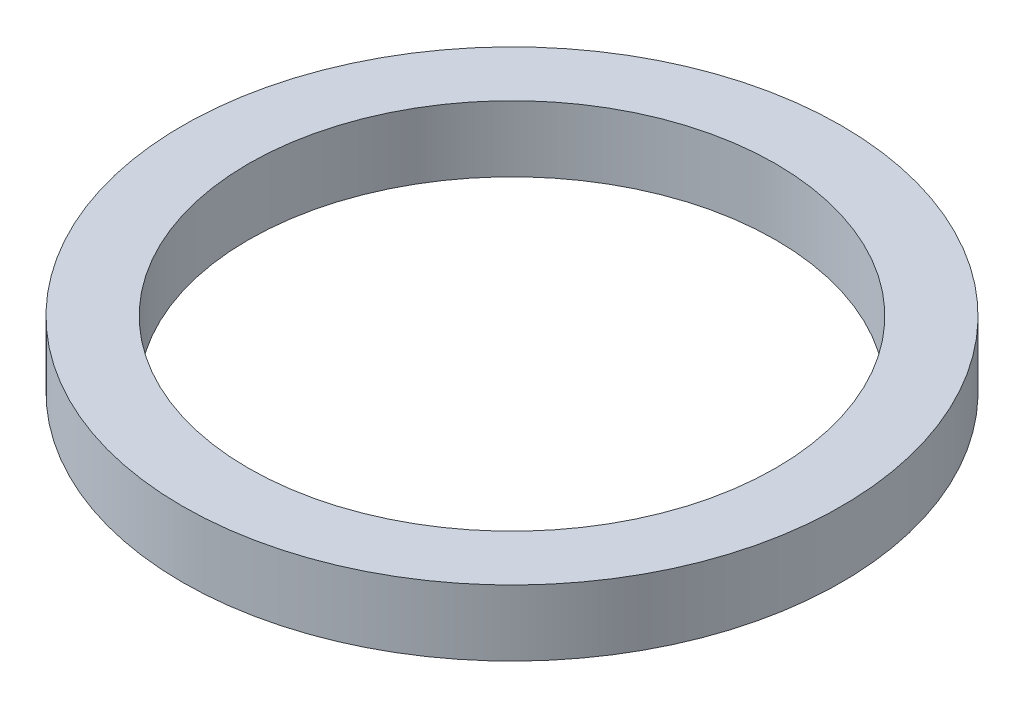
ISO-10303-21;
HEADER;
FILE_DESCRIPTION(('STEP AP214'),'2;1');
FILE_NAME('part.step','',(''),(''),'','','');
FILE_SCHEMA(('AUTOMOTIVE_DESIGN { 1 0 10303 214 1 1 1 1 }'));
ENDSEC;
DATA;
#1=APPLICATION_CONTEXT('core data for automotive mechanical design processes');
#2=APPLICATION_PROTOCOL_DEFINITION('international standard','automotive_design',2000,#1);
#3=PRODUCT_CONTEXT('',#1,'mechanical');
#4=PRODUCT('Part','Part','',(#3));
#5=PRODUCT_RELATED_PRODUCT_CATEGORY('part','',(#4));
#6=PRODUCT_DEFINITION_FORMATION('','',#4);
#7=PRODUCT_DEFINITION_CONTEXT('part definition',#1,'design');
#8=PRODUCT_DEFINITION('design','',#6,#7);
#9=PRODUCT_DEFINITION_SHAPE('','',#8);
#10=(LENGTH_UNIT() NAMED_UNIT(*) SI_UNIT(.MILLI.,.METRE.));
#11=(NAMED_UNIT(*) PLANE_ANGLE_UNIT() SI_UNIT($,.RADIAN.));
#12=(NAMED_UNIT(*) SI_UNIT($,.STERADIAN.) SOLID_ANGLE_UNIT());
#13=UNCERTAINTY_MEASURE_WITH_UNIT(LENGTH_MEASURE(1.E-05),#10,'distance_accuracy_value','');
#14=(GEOMETRIC_REPRESENTATION_CONTEXT(3) GLOBAL_UNCERTAINTY_ASSIGNED_CONTEXT((#13)) GLOBAL_UNIT_ASSIGNED_CONTEXT((#10,
#11,#12)) REPRESENTATION_CONTEXT('',''));
#15=CARTESIAN_POINT('',(0.,0.,0.));
#16=DIRECTION('',(0.,0.,1.));
#17=DIRECTION('',(1.,0.,0.));
#18=AXIS2_PLACEMENT_3D('',#15,#16,#17);
#19=CARTESIAN_POINT('',(0.,10.,0.));
#20=DIRECTION('',(0.,1.,0.));
#21=DIRECTION('',(0.,0.,1.));
#22=AXIS2_PLACEMENT_3D('',#19,#20,#21);
#23=PLANE('',#22);
#24=CARTESIAN_POINT('',(0.,10.,0.));
#25=DIRECTION('',(0.,1.,0.));
#26=DIRECTION('',(0.,0.,1.));
#27=AXIS2_PLACEMENT_3D('',#24,#25,#26);
#28=CIRCLE('',#27,50.);
#29=CARTESIAN_POINT('',(0.,10.,50.));
#30=VERTEX_POINT('',#29);
#31=EDGE_CURVE('E10',#30,#30,#28,.T.);
#32=ORIENTED_EDGE('',*,*,#31,.T.);
#33=EDGE_LOOP('',(#32));
#34=FACE_BOUND('',#33,.T.);
#35=CARTESIAN_POINT('',(0.,10.,0.));
#36=DIRECTION('',(0.,1.,0.));
#37=DIRECTION('',(0.,0.,1.));
#38=AXIS2_PLACEMENT_3D('',#35,#36,#37);
#39=CIRCLE('',#38,40.);
#40=CARTESIAN_POINT('',(0.,10.,40.));
#41=VERTEX_POINT('',#40);
#42=EDGE_CURVE('E42',#41,#41,#39,.T.);
#43=ORIENTED_EDGE('',*,*,#42,.F.);
#44=EDGE_LOOP('',(#43));
#45=FACE_BOUND('',#44,.T.);
#46=ADVANCED_FACE('F31',(#34,#45),#23,.T.);
#47=CARTESIAN_POINT('',(0.,0.,0.));
#48=DIRECTION('',(0.,1.,0.));
#49=DIRECTION('',(0.,0.,1.));
#50=AXIS2_PLACEMENT_3D('',#47,#48,#49);
#51=PLANE('',#50);
#52=CARTESIAN_POINT('',(0.,0.,0.));
#53=DIRECTION('',(0.,1.,0.));
#54=DIRECTION('',(0.,0.,1.));
#55=AXIS2_PLACEMENT_3D('',#52,#53,#54);
#56=CIRCLE('',#55,50.);
#57=CARTESIAN_POINT('',(0.,0.,50.));
#58=VERTEX_POINT('',#57);
#59=EDGE_CURVE('E35',#58,#58,#56,.T.);
#60=ORIENTED_EDGE('',*,*,#59,.F.);
#61=EDGE_LOOP('',(#60));
#62=FACE_BOUND('',#61,.T.);
#63=CARTESIAN_POINT('',(0.,0.,0.));
#64=DIRECTION('',(0.,1.,0.));
#65=DIRECTION('',(0.,0.,1.));
#66=AXIS2_PLACEMENT_3D('',#63,#64,#65);
#67=CIRCLE('',#66,40.);
#68=CARTESIAN_POINT('',(0.,0.,40.));
#69=VERTEX_POINT('',#68);
#70=EDGE_CURVE('E44',#69,#69,#67,.T.);
#71=ORIENTED_EDGE('',*,*,#70,.T.);
#72=EDGE_LOOP('',(#71));
#73=FACE_BOUND('',#72,.T.);
#74=ADVANCED_FACE('F54',(#62,#73),#51,.F.);
#75=CARTESIAN_POINT('',(0.,10.,0.));
#76=DIRECTION('',(0.,-1.,0.));
#77=DIRECTION('',(0.,0.,-1.));
#78=AXIS2_PLACEMENT_3D('',#75,#76,#77);
#79=CYLINDRICAL_SURFACE('',#78,50.);
#80=ORIENTED_EDGE('',*,*,#31,.F.);
#81=EDGE_LOOP('',(#80));
#82=FACE_BOUND('',#81,.T.);
#83=ORIENTED_EDGE('',*,*,#59,.T.);
#84=EDGE_LOOP('',(#83));
#85=FACE_BOUND('',#84,.T.);
#86=ADVANCED_FACE('F33',(#82,#85),#79,.T.);
#87=CARTESIAN_POINT('',(0.,10.,0.));
#88=DIRECTION('',(0.,-1.,0.));
#89=DIRECTION('',(0.,0.,-1.));
#90=AXIS2_PLACEMENT_3D('',#87,#88,#89);
#91=CYLINDRICAL_SURFACE('',#90,40.);
#92=ORIENTED_EDGE('',*,*,#42,.T.);
#93=EDGE_LOOP('',(#92));
#94=FACE_BOUND('',#93,.T.);
#95=ORIENTED_EDGE('',*,*,#70,.F.);
#96=EDGE_LOOP('',(#95));
#97=FACE_BOUND('',#96,.T.);
#98=ADVANCED_FACE('F50',(#94,#97),#91,.F.);
#99=CLOSED_SHELL('',(#46,#74,#86,#98));
#100=MANIFOLD_SOLID_BREP('B2',#99);
#101=ADVANCED_BREP_SHAPE_REPRESENTATION('',(#18,#100),#14);
#102=SHAPE_DEFINITION_REPRESENTATION(#9,#101);
ENDSEC;
END-ISO-10303-21;
